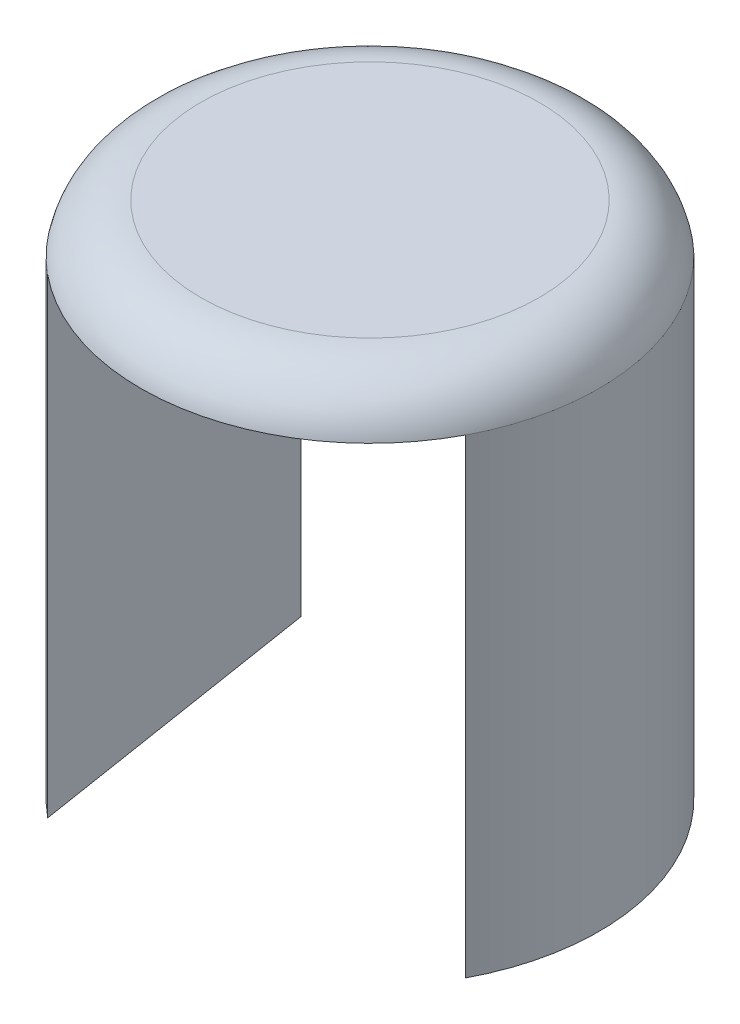
ISO-10303-21;
HEADER;
FILE_DESCRIPTION(('STEP AP214'),'2;1');
FILE_NAME('part.step','',(''),(''),'','','');
FILE_SCHEMA(('AUTOMOTIVE_DESIGN { 1 0 10303 214 1 1 1 1 }'));
ENDSEC;
DATA;
#1=APPLICATION_CONTEXT('core data for automotive mechanical design processes');
#2=APPLICATION_PROTOCOL_DEFINITION('international standard','automotive_design',2000,#1);
#3=PRODUCT_CONTEXT('',#1,'mechanical');
#4=PRODUCT('Part','Part','',(#3));
#5=PRODUCT_RELATED_PRODUCT_CATEGORY('part','',(#4));
#6=PRODUCT_DEFINITION_FORMATION('','',#4);
#7=PRODUCT_DEFINITION_CONTEXT('part definition',#1,'design');
#8=PRODUCT_DEFINITION('design','',#6,#7);
#9=PRODUCT_DEFINITION_SHAPE('','',#8);
#10=(LENGTH_UNIT() NAMED_UNIT(*) SI_UNIT(.MILLI.,.METRE.));
#11=(NAMED_UNIT(*) PLANE_ANGLE_UNIT() SI_UNIT($,.RADIAN.));
#12=(NAMED_UNIT(*) SI_UNIT($,.STERADIAN.) SOLID_ANGLE_UNIT());
#13=UNCERTAINTY_MEASURE_WITH_UNIT(LENGTH_MEASURE(1.E-05),#10,'distance_accuracy_value','');
#14=(GEOMETRIC_REPRESENTATION_CONTEXT(3) GLOBAL_UNCERTAINTY_ASSIGNED_CONTEXT((#13)) GLOBAL_UNIT_ASSIGNED_CONTEXT((#10,
#11,#12)) REPRESENTATION_CONTEXT('',''));
#15=CARTESIAN_POINT('',(0.,0.,0.));
#16=DIRECTION('',(0.,0.,1.));
#17=DIRECTION('',(1.,0.,0.));
#18=AXIS2_PLACEMENT_3D('',#15,#16,#17);
#19=CARTESIAN_POINT('',(0.,0.,0.));
#20=DIRECTION('',(0.,1.,0.));
#21=DIRECTION('',(0.,0.,1.));
#22=AXIS2_PLACEMENT_3D('',#19,#20,#21);
#23=PLANE('',#22);
#24=CARTESIAN_POINT('',(0.,0.,0.));
#25=DIRECTION('',(0.,1.,0.));
#26=DIRECTION('',(0.,0.,1.));
#27=AXIS2_PLACEMENT_3D('',#24,#25,#26);
#28=CIRCLE('',#27,37.5);
#29=CARTESIAN_POINT('',(26.1103316330834,0.,-26.9165484787779));
#30=VERTEX_POINT('',#29);
#31=CARTESIAN_POINT('',(-31.5579305380191,0.,-20.2570239708987));
#32=VERTEX_POINT('',#31);
#33=EDGE_CURVE('E103',#30,#32,#28,.T.);
#34=ORIENTED_EDGE('',*,*,#33,.F.);
#35=DIRECTION('',(0.156454394751382,0.,0.987685183832874));
#36=VECTOR('',#35,1.);
#37=CARTESIAN_POINT('',(29.6305555149889,0.,-4.69363184254188));
#38=LINE('',#37,#36);
#39=CARTESIAN_POINT('',(33.1507793968945,0.,17.5292847936942));
#40=VERTEX_POINT('',#39);
#41=EDGE_CURVE('E56',#30,#40,#38,.T.);
#42=ORIENTED_EDGE('',*,*,#41,.T.);
#43=CARTESIAN_POINT('',(-23.7524397566165,0.,29.0184700769752));
#44=VERTEX_POINT('',#43);
#45=EDGE_CURVE('E101',#44,#40,#28,.T.);
#46=ORIENTED_EDGE('',*,*,#45,.F.);
#47=DIRECTION('',(0.156454394751382,0.,0.987685183832874));
#48=VECTOR('',#47,1.);
#49=CARTESIAN_POINT('',(-27.6551851473178,0.,4.38072305303825));
#50=LINE('',#49,#48);
#51=EDGE_CURVE('E64',#32,#44,#50,.T.);
#52=ORIENTED_EDGE('',*,*,#51,.F.);
#53=EDGE_LOOP('',(#34,#42,#46,#52));
#54=FACE_BOUND('',#53,.T.);
#55=ADVANCED_FACE('F41',(#54),#23,.F.);
#56=CARTESIAN_POINT('',(0.,8.,0.));
#57=DIRECTION('',(0.,1.,0.));
#58=DIRECTION('',(0.,0.,1.));
#59=AXIS2_PLACEMENT_3D('',#56,#57,#58);
#60=PLANE('',#59);
#61=CARTESIAN_POINT('',(0.,8.,0.));
#62=DIRECTION('',(0.,1.,0.));
#63=DIRECTION('',(0.,0.,1.));
#64=AXIS2_PLACEMENT_3D('',#61,#62,#63);
#65=CIRCLE('',#64,27.7020410288673);
#66=CARTESIAN_POINT('',(0.,8.,27.7020410288673));
#67=VERTEX_POINT('',#66);
#68=EDGE_CURVE('E11',#67,#67,#65,.T.);
#69=ORIENTED_EDGE('',*,*,#68,.T.);
#70=EDGE_LOOP('',(#69));
#71=FACE_BOUND('',#70,.T.);
#72=ADVANCED_FACE('F132',(#71),#60,.T.);
#73=CARTESIAN_POINT('',(0.,-2.,0.));
#74=DIRECTION('',(0.,-1.,0.));
#75=DIRECTION('',(0.,0.,-1.));
#76=AXIS2_PLACEMENT_3D('',#73,#74,#75);
#77=TOROIDAL_SURFACE('',#76,27.7020410288673,10.);
#78=EDGE_CURVE('E49',#32,#44,#28,.T.);
#79=ORIENTED_EDGE('',*,*,#78,.T.);
#80=ORIENTED_EDGE('',*,*,#45,.T.);
#81=CARTESIAN_POINT('',(0.,0.,0.));
#82=DIRECTION('',(0.,-1.,0.));
#83=DIRECTION('',(0.,0.,-1.));
#84=AXIS2_PLACEMENT_3D('',#81,#82,#83);
#85=CIRCLE('',#84,37.5);
#86=EDGE_CURVE('E91',#30,#40,#85,.T.);
#87=ORIENTED_EDGE('',*,*,#86,.F.);
#88=ORIENTED_EDGE('',*,*,#33,.T.);
#89=EDGE_LOOP('',(#79,#80,#87,#88));
#90=FACE_BOUND('',#89,.T.);
#91=ORIENTED_EDGE('',*,*,#68,.F.);
#92=EDGE_LOOP('',(#91));
#93=FACE_BOUND('',#92,.T.);
#94=ADVANCED_FACE('F43',(#90,#93),#77,.T.);
#95=CARTESIAN_POINT('',(-27.6551851473178,-128.157303743527,4.38072305303825));
#96=DIRECTION('',(-0.987685183832874,0.,0.156454394751382));
#97=DIRECTION('',(0.156454394751382,0.,0.987685183832874));
#98=AXIS2_PLACEMENT_3D('',#95,#96,#97);
#99=PLANE('',#98);
#100=DIRECTION('',(0.,1.,0.));
#101=VECTOR('',#100,1.);
#102=CARTESIAN_POINT('',(-23.7524397566165,-128.157303743527,29.0184700769752));
#103=LINE('',#102,#101);
#104=CARTESIAN_POINT('',(-23.7524397566165,-77.,29.0184700769752));
#105=VERTEX_POINT('',#104);
#106=EDGE_CURVE('E114',#105,#44,#103,.T.);
#107=ORIENTED_EDGE('',*,*,#106,.F.);
#108=DIRECTION('',(-0.156454394751382,0.,-0.987685183832875));
#109=VECTOR('',#108,1.);
#110=CARTESIAN_POINT('',(-27.6551851473178,-77.,4.38072305303825));
#111=LINE('',#110,#109);
#112=CARTESIAN_POINT('',(-31.5579305380191,-77.,-20.2570239708987));
#113=VERTEX_POINT('',#112);
#114=EDGE_CURVE('E109',#105,#113,#111,.T.);
#115=ORIENTED_EDGE('',*,*,#114,.T.);
#116=DIRECTION('',(0.,1.,0.));
#117=VECTOR('',#116,1.);
#118=CARTESIAN_POINT('',(-31.5579305380191,-128.157303743527,-20.2570239708987));
#119=LINE('',#118,#117);
#120=EDGE_CURVE('E112',#113,#32,#119,.T.);
#121=ORIENTED_EDGE('',*,*,#120,.T.);
#122=ORIENTED_EDGE('',*,*,#51,.T.);
#123=EDGE_LOOP('',(#107,#115,#121,#122));
#124=FACE_BOUND('',#123,.T.);
#125=ADVANCED_FACE('F143',(#124),#99,.F.);
#126=CARTESIAN_POINT('',(0.,-128.157303743527,0.));
#127=DIRECTION('',(0.,1.,0.));
#128=DIRECTION('',(0.,0.,1.));
#129=AXIS2_PLACEMENT_3D('',#126,#127,#128);
#130=CYLINDRICAL_SURFACE('',#129,37.5);
#131=ORIENTED_EDGE('',*,*,#120,.F.);
#132=CARTESIAN_POINT('',(0.,-77.,0.));
#133=DIRECTION('',(0.,1.,0.));
#134=DIRECTION('',(0.,0.,1.));
#135=AXIS2_PLACEMENT_3D('',#132,#133,#134);
#136=CIRCLE('',#135,37.5);
#137=EDGE_CURVE('E107',#113,#105,#136,.T.);
#138=ORIENTED_EDGE('',*,*,#137,.T.);
#139=ORIENTED_EDGE('',*,*,#106,.T.);
#140=ORIENTED_EDGE('',*,*,#78,.F.);
#141=EDGE_LOOP('',(#131,#138,#139,#140));
#142=FACE_BOUND('',#141,.T.);
#143=ADVANCED_FACE('F139',(#142),#130,.T.);
#144=CARTESIAN_POINT('',(0.,-77.,0.));
#145=DIRECTION('',(0.,1.,0.));
#146=DIRECTION('',(0.156454394751382,0.,0.987685183832874));
#147=AXIS2_PLACEMENT_3D('',#144,#145,#146);
#148=PLANE('',#147);
#149=ORIENTED_EDGE('',*,*,#114,.F.);
#150=ORIENTED_EDGE('',*,*,#137,.F.);
#151=EDGE_LOOP('',(#149,#150));
#152=FACE_BOUND('',#151,.T.);
#153=ADVANCED_FACE('F142',(#152),#148,.F.);
#154=CARTESIAN_POINT('',(0.,-128.157303743527,0.));
#155=DIRECTION('',(0.,1.,0.));
#156=DIRECTION('',(0.,0.,1.));
#157=AXIS2_PLACEMENT_3D('',#154,#155,#156);
#158=CYLINDRICAL_SURFACE('',#157,37.5);
#159=DIRECTION('',(0.,1.,0.));
#160=VECTOR('',#159,1.);
#161=CARTESIAN_POINT('',(33.1507793968945,-128.157303743527,17.5292847936942));
#162=LINE('',#161,#160);
#163=CARTESIAN_POINT('',(33.1507793968945,-77.,17.5292847936942));
#164=VERTEX_POINT('',#163);
#165=EDGE_CURVE('E84',#164,#40,#162,.T.);
#166=ORIENTED_EDGE('',*,*,#165,.F.);
#167=CARTESIAN_POINT('',(0.,-77.,0.));
#168=DIRECTION('',(0.,1.,0.));
#169=DIRECTION('',(0.,0.,1.));
#170=AXIS2_PLACEMENT_3D('',#167,#168,#169);
#171=CIRCLE('',#170,37.5);
#172=CARTESIAN_POINT('',(26.1103316330834,-77.,-26.9165484787779));
#173=VERTEX_POINT('',#172);
#174=EDGE_CURVE('E119',#164,#173,#171,.T.);
#175=ORIENTED_EDGE('',*,*,#174,.T.);
#176=DIRECTION('',(0.,1.,0.));
#177=VECTOR('',#176,1.);
#178=CARTESIAN_POINT('',(26.1103316330834,-128.157303743527,-26.9165484787779));
#179=LINE('',#178,#177);
#180=EDGE_CURVE('E90',#173,#30,#179,.T.);
#181=ORIENTED_EDGE('',*,*,#180,.T.);
#182=ORIENTED_EDGE('',*,*,#86,.T.);
#183=EDGE_LOOP('',(#166,#175,#181,#182));
#184=FACE_BOUND('',#183,.T.);
#185=ADVANCED_FACE('F94',(#184),#158,.T.);
#186=CARTESIAN_POINT('',(29.6305555149889,-128.157303743527,-4.69363184254188));
#187=DIRECTION('',(-0.987685183832874,0.,0.156454394751382));
#188=DIRECTION('',(0.156454394751382,0.,0.987685183832874));
#189=AXIS2_PLACEMENT_3D('',#186,#187,#188);
#190=PLANE('',#189);
#191=DIRECTION('',(-0.156454394751382,0.,-0.987685183832875));
#192=VECTOR('',#191,1.);
#193=CARTESIAN_POINT('',(29.6305555149889,-77.,-4.69363184254188));
#194=LINE('',#193,#192);
#195=EDGE_CURVE('E87',#164,#173,#194,.T.);
#196=ORIENTED_EDGE('',*,*,#195,.F.);
#197=ORIENTED_EDGE('',*,*,#165,.T.);
#198=ORIENTED_EDGE('',*,*,#41,.F.);
#199=ORIENTED_EDGE('',*,*,#180,.F.);
#200=EDGE_LOOP('',(#196,#197,#198,#199));
#201=FACE_BOUND('',#200,.T.);
#202=ADVANCED_FACE('F86',(#201),#190,.T.);
#203=CARTESIAN_POINT('',(0.,-77.,0.));
#204=DIRECTION('',(0.,1.,0.));
#205=DIRECTION('',(0.156454394751382,0.,0.987685183832874));
#206=AXIS2_PLACEMENT_3D('',#203,#204,#205);
#207=PLANE('',#206);
#208=ORIENTED_EDGE('',*,*,#195,.T.);
#209=ORIENTED_EDGE('',*,*,#174,.F.);
#210=EDGE_LOOP('',(#208,#209));
#211=FACE_BOUND('',#210,.T.);
#212=ADVANCED_FACE('F123',(#211),#207,.F.);
#213=CLOSED_SHELL('',(#55,#72,#94,#125,#143,#153,#185,#202,#212));
#214=MANIFOLD_SOLID_BREP('B2',#213);
#215=ADVANCED_BREP_SHAPE_REPRESENTATION('',(#18,#214),#14);
#216=SHAPE_DEFINITION_REPRESENTATION(#9,#215);
ENDSEC;
END-ISO-10303-21;
